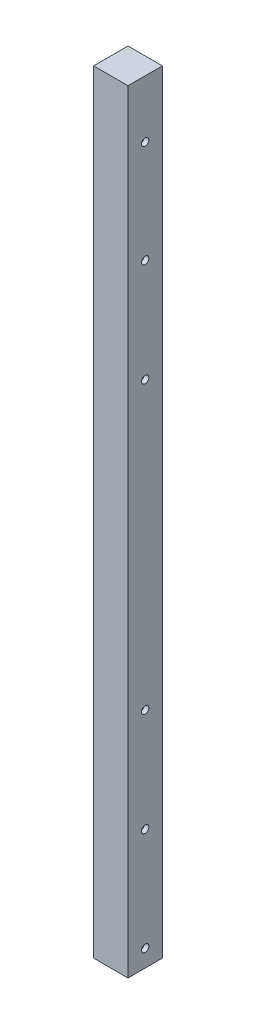
ISO-10303-21;
HEADER;
FILE_DESCRIPTION(('STEP AP214'),'2;1');
FILE_NAME('part.step','',(''),(''),'','','');
FILE_SCHEMA(('AUTOMOTIVE_DESIGN { 1 0 10303 214 1 1 1 1 }'));
ENDSEC;
DATA;
#1=APPLICATION_CONTEXT('core data for automotive mechanical design processes');
#2=APPLICATION_PROTOCOL_DEFINITION('international standard','automotive_design',2000,#1);
#3=PRODUCT_CONTEXT('',#1,'mechanical');
#4=PRODUCT('Part','Part','',(#3));
#5=PRODUCT_RELATED_PRODUCT_CATEGORY('part','',(#4));
#6=PRODUCT_DEFINITION_FORMATION('','',#4);
#7=PRODUCT_DEFINITION_CONTEXT('part definition',#1,'design');
#8=PRODUCT_DEFINITION('design','',#6,#7);
#9=PRODUCT_DEFINITION_SHAPE('','',#8);
#10=(LENGTH_UNIT() NAMED_UNIT(*) SI_UNIT(.MILLI.,.METRE.));
#11=(NAMED_UNIT(*) PLANE_ANGLE_UNIT() SI_UNIT($,.RADIAN.));
#12=(NAMED_UNIT(*) SI_UNIT($,.STERADIAN.) SOLID_ANGLE_UNIT());
#13=UNCERTAINTY_MEASURE_WITH_UNIT(LENGTH_MEASURE(1.E-05),#10,'distance_accuracy_value','');
#14=(GEOMETRIC_REPRESENTATION_CONTEXT(3) GLOBAL_UNCERTAINTY_ASSIGNED_CONTEXT((#13)) GLOBAL_UNIT_ASSIGNED_CONTEXT((#10,
#11,#12)) REPRESENTATION_CONTEXT('',''));
#15=CARTESIAN_POINT('',(0.,0.,0.));
#16=DIRECTION('',(0.,0.,1.));
#17=DIRECTION('',(1.,0.,0.));
#18=AXIS2_PLACEMENT_3D('',#15,#16,#17);
#19=CARTESIAN_POINT('',(0.,0.,0.));
#20=DIRECTION('',(0.,-1.,0.));
#21=DIRECTION('',(0.,0.,-1.));
#22=AXIS2_PLACEMENT_3D('',#19,#20,#21);
#23=PLANE('',#22);
#24=DIRECTION('',(0.,0.,1.));
#25=VECTOR('',#24,1.);
#26=CARTESIAN_POINT('',(0.,0.,0.));
#27=LINE('',#26,#25);
#28=CARTESIAN_POINT('',(0.,0.,-15.));
#29=VERTEX_POINT('',#28);
#30=CARTESIAN_POINT('',(0.,0.,0.));
#31=VERTEX_POINT('',#30);
#32=EDGE_CURVE('E116',#29,#31,#27,.T.);
#33=ORIENTED_EDGE('',*,*,#32,.F.);
#34=DIRECTION('',(-1.,0.,0.));
#35=VECTOR('',#34,1.);
#36=CARTESIAN_POINT('',(0.,0.,-15.));
#37=LINE('',#36,#35);
#38=CARTESIAN_POINT('',(15.,0.,-15.));
#39=VERTEX_POINT('',#38);
#40=EDGE_CURVE('E259',#39,#29,#37,.T.);
#41=ORIENTED_EDGE('',*,*,#40,.F.);
#42=DIRECTION('',(0.,0.,-1.));
#43=VECTOR('',#42,1.);
#44=CARTESIAN_POINT('',(15.,0.,0.));
#45=LINE('',#44,#43);
#46=CARTESIAN_POINT('',(15.,0.,0.));
#47=VERTEX_POINT('',#46);
#48=EDGE_CURVE('E265',#47,#39,#45,.T.);
#49=ORIENTED_EDGE('',*,*,#48,.F.);
#50=DIRECTION('',(1.,0.,0.));
#51=VECTOR('',#50,1.);
#52=CARTESIAN_POINT('',(0.,0.,0.));
#53=LINE('',#52,#51);
#54=EDGE_CURVE('E262',#31,#47,#53,.T.);
#55=ORIENTED_EDGE('',*,*,#54,.F.);
#56=EDGE_LOOP('',(#33,#41,#49,#55));
#57=FACE_BOUND('',#56,.T.);
#58=DIRECTION('',(0.,0.,1.));
#59=VECTOR('',#58,1.);
#60=CARTESIAN_POINT('',(2.,0.,-2.));
#61=LINE('',#60,#59);
#62=CARTESIAN_POINT('',(2.,0.,-13.));
#63=VERTEX_POINT('',#62);
#64=CARTESIAN_POINT('',(2.,0.,-2.));
#65=VERTEX_POINT('',#64);
#66=EDGE_CURVE('E241',#63,#65,#61,.T.);
#67=ORIENTED_EDGE('',*,*,#66,.T.);
#68=DIRECTION('',(1.,0.,0.));
#69=VECTOR('',#68,1.);
#70=CARTESIAN_POINT('',(2.,0.,-2.));
#71=LINE('',#70,#69);
#72=CARTESIAN_POINT('',(13.,0.,-2.));
#73=VERTEX_POINT('',#72);
#74=EDGE_CURVE('E229',#65,#73,#71,.T.);
#75=ORIENTED_EDGE('',*,*,#74,.T.);
#76=DIRECTION('',(0.,0.,-1.));
#77=VECTOR('',#76,1.);
#78=CARTESIAN_POINT('',(13.,0.,-2.));
#79=LINE('',#78,#77);
#80=CARTESIAN_POINT('',(13.,0.,-13.));
#81=VERTEX_POINT('',#80);
#82=EDGE_CURVE('E233',#73,#81,#79,.T.);
#83=ORIENTED_EDGE('',*,*,#82,.T.);
#84=DIRECTION('',(-1.,0.,0.));
#85=VECTOR('',#84,1.);
#86=CARTESIAN_POINT('',(2.,0.,-13.));
#87=LINE('',#86,#85);
#88=EDGE_CURVE('E237',#81,#63,#87,.T.);
#89=ORIENTED_EDGE('',*,*,#88,.T.);
#90=EDGE_LOOP('',(#67,#75,#83,#89));
#91=FACE_BOUND('',#90,.T.);
#92=ADVANCED_FACE('F45',(#57,#91),#23,.T.);
#93=CARTESIAN_POINT('',(0.,337.,0.));
#94=DIRECTION('',(1.,0.,0.));
#95=DIRECTION('',(0.,0.,-1.));
#96=AXIS2_PLACEMENT_3D('',#93,#94,#95);
#97=PLANE('',#96);
#98=CARTESIAN_POINT('',(0.,7.5,-7.49999999999996));
#99=DIRECTION('',(-1.,0.,0.));
#100=DIRECTION('',(0.,0.,1.));
#101=AXIS2_PLACEMENT_3D('',#98,#99,#100);
#102=CIRCLE('',#101,1.6);
#103=CARTESIAN_POINT('',(0.,7.5,-5.89999999999996));
#104=VERTEX_POINT('',#103);
#105=EDGE_CURVE('E145',#104,#104,#102,.T.);
#106=ORIENTED_EDGE('',*,*,#105,.F.);
#107=EDGE_LOOP('',(#106));
#108=FACE_BOUND('',#107,.T.);
#109=CARTESIAN_POINT('',(0.,222.3,-7.49999999999999));
#110=DIRECTION('',(-1.,0.,0.));
#111=DIRECTION('',(0.,0.,1.));
#112=AXIS2_PLACEMENT_3D('',#109,#110,#111);
#113=CIRCLE('',#112,1.6);
#114=CARTESIAN_POINT('',(0.,222.3,-5.89999999999999));
#115=VERTEX_POINT('',#114);
#116=EDGE_CURVE('E150',#115,#115,#113,.T.);
#117=ORIENTED_EDGE('',*,*,#116,.F.);
#118=EDGE_LOOP('',(#117));
#119=FACE_BOUND('',#118,.T.);
#120=CARTESIAN_POINT('',(0.,97.5,-7.49999999999997));
#121=DIRECTION('',(-1.,0.,0.));
#122=DIRECTION('',(0.,0.,1.));
#123=AXIS2_PLACEMENT_3D('',#120,#121,#122);
#124=CIRCLE('',#123,1.6);
#125=CARTESIAN_POINT('',(0.,97.5,-5.89999999999997));
#126=VERTEX_POINT('',#125);
#127=EDGE_CURVE('E182',#126,#126,#124,.T.);
#128=ORIENTED_EDGE('',*,*,#127,.F.);
#129=EDGE_LOOP('',(#128));
#130=FACE_BOUND('',#129,.T.);
#131=CARTESIAN_POINT('',(0.,52.5,-7.49999999999997));
#132=DIRECTION('',(-1.,0.,0.));
#133=DIRECTION('',(0.,0.,1.));
#134=AXIS2_PLACEMENT_3D('',#131,#132,#133);
#135=CIRCLE('',#134,1.6);
#136=CARTESIAN_POINT('',(0.,52.5,-5.89999999999997));
#137=VERTEX_POINT('',#136);
#138=EDGE_CURVE('E174',#137,#137,#135,.T.);
#139=ORIENTED_EDGE('',*,*,#138,.F.);
#140=EDGE_LOOP('',(#139));
#141=FACE_BOUND('',#140,.T.);
#142=CARTESIAN_POINT('',(0.,267.300000000004,-7.49999999999999));
#143=DIRECTION('',(-1.,0.,0.));
#144=DIRECTION('',(0.,0.,1.));
#145=AXIS2_PLACEMENT_3D('',#142,#143,#144);
#146=CIRCLE('',#145,1.6);
#147=CARTESIAN_POINT('',(0.,267.300000000004,-5.9));
#148=VERTEX_POINT('',#147);
#149=EDGE_CURVE('E166',#148,#148,#146,.T.);
#150=ORIENTED_EDGE('',*,*,#149,.F.);
#151=EDGE_LOOP('',(#150));
#152=FACE_BOUND('',#151,.T.);
#153=CARTESIAN_POINT('',(0.,312.,-7.5));
#154=DIRECTION('',(-1.,0.,0.));
#155=DIRECTION('',(0.,0.,1.));
#156=AXIS2_PLACEMENT_3D('',#153,#154,#155);
#157=CIRCLE('',#156,1.59999999999999);
#158=CARTESIAN_POINT('',(0.,312.,-5.9));
#159=VERTEX_POINT('',#158);
#160=EDGE_CURVE('E149',#159,#159,#157,.T.);
#161=ORIENTED_EDGE('',*,*,#160,.F.);
#162=EDGE_LOOP('',(#161));
#163=FACE_BOUND('',#162,.T.);
#164=DIRECTION('',(0.,-1.,0.));
#165=VECTOR('',#164,1.);
#166=CARTESIAN_POINT('',(0.,337.,0.));
#167=LINE('',#166,#165);
#168=CARTESIAN_POINT('',(0.,337.,0.));
#169=VERTEX_POINT('',#168);
#170=EDGE_CURVE('E55',#169,#31,#167,.T.);
#171=ORIENTED_EDGE('',*,*,#170,.F.);
#172=DIRECTION('',(0.,0.,-1.));
#173=VECTOR('',#172,1.);
#174=CARTESIAN_POINT('',(0.,337.,-15.));
#175=LINE('',#174,#173);
#176=CARTESIAN_POINT('',(0.,337.,-15.));
#177=VERTEX_POINT('',#176);
#178=EDGE_CURVE('E114',#169,#177,#175,.T.);
#179=ORIENTED_EDGE('',*,*,#178,.T.);
#180=DIRECTION('',(0.,-1.,0.));
#181=VECTOR('',#180,1.);
#182=CARTESIAN_POINT('',(0.,337.,-15.));
#183=LINE('',#182,#181);
#184=EDGE_CURVE('E258',#177,#29,#183,.T.);
#185=ORIENTED_EDGE('',*,*,#184,.T.);
#186=ORIENTED_EDGE('',*,*,#32,.T.);
#187=EDGE_LOOP('',(#171,#179,#185,#186));
#188=FACE_BOUND('',#187,.T.);
#189=ADVANCED_FACE('F47',(#108,#119,#130,#141,#152,#163,#188),#97,.F.);
#190=CARTESIAN_POINT('',(0.,337.,0.));
#191=DIRECTION('',(0.,0.,-1.));
#192=DIRECTION('',(-1.,0.,0.));
#193=AXIS2_PLACEMENT_3D('',#190,#191,#192);
#194=PLANE('',#193);
#195=DIRECTION('',(0.,-1.,0.));
#196=VECTOR('',#195,1.);
#197=CARTESIAN_POINT('',(15.,337.,0.));
#198=LINE('',#197,#196);
#199=CARTESIAN_POINT('',(15.,337.,0.));
#200=VERTEX_POINT('',#199);
#201=EDGE_CURVE('E121',#200,#47,#198,.T.);
#202=ORIENTED_EDGE('',*,*,#201,.F.);
#203=DIRECTION('',(-1.,0.,0.));
#204=VECTOR('',#203,1.);
#205=CARTESIAN_POINT('',(30.5291427061513,337.,0.));
#206=LINE('',#205,#204);
#207=EDGE_CURVE('E124',#200,#169,#206,.T.);
#208=ORIENTED_EDGE('',*,*,#207,.T.);
#209=ORIENTED_EDGE('',*,*,#170,.T.);
#210=ORIENTED_EDGE('',*,*,#54,.T.);
#211=EDGE_LOOP('',(#202,#208,#209,#210));
#212=FACE_BOUND('',#211,.T.);
#213=ADVANCED_FACE('F125',(#212),#194,.F.);
#214=CARTESIAN_POINT('',(15.,337.,0.));
#215=DIRECTION('',(-1.,0.,0.));
#216=DIRECTION('',(0.,0.,1.));
#217=AXIS2_PLACEMENT_3D('',#214,#215,#216);
#218=PLANE('',#217);
#219=CARTESIAN_POINT('',(15.,7.5,-7.49999999999996));
#220=DIRECTION('',(-1.,0.,0.));
#221=DIRECTION('',(0.,0.,1.));
#222=AXIS2_PLACEMENT_3D('',#219,#220,#221);
#223=CIRCLE('',#222,1.6);
#224=CARTESIAN_POINT('',(15.,7.5,-5.89999999999996));
#225=VERTEX_POINT('',#224);
#226=EDGE_CURVE('E140',#225,#225,#223,.T.);
#227=ORIENTED_EDGE('',*,*,#226,.T.);
#228=EDGE_LOOP('',(#227));
#229=FACE_BOUND('',#228,.T.);
#230=CARTESIAN_POINT('',(15.,222.3,-7.49999999999999));
#231=DIRECTION('',(-1.,0.,0.));
#232=DIRECTION('',(0.,0.,1.));
#233=AXIS2_PLACEMENT_3D('',#230,#231,#232);
#234=CIRCLE('',#233,1.6);
#235=CARTESIAN_POINT('',(15.,222.3,-5.89999999999999));
#236=VERTEX_POINT('',#235);
#237=EDGE_CURVE('E155',#236,#236,#234,.T.);
#238=ORIENTED_EDGE('',*,*,#237,.T.);
#239=EDGE_LOOP('',(#238));
#240=FACE_BOUND('',#239,.T.);
#241=CARTESIAN_POINT('',(15.,97.5,-7.49999999999997));
#242=DIRECTION('',(-1.,0.,0.));
#243=DIRECTION('',(0.,0.,1.));
#244=AXIS2_PLACEMENT_3D('',#241,#242,#243);
#245=CIRCLE('',#244,1.6);
#246=CARTESIAN_POINT('',(15.,97.5,-5.89999999999997));
#247=VERTEX_POINT('',#246);
#248=EDGE_CURVE('E154',#247,#247,#245,.T.);
#249=ORIENTED_EDGE('',*,*,#248,.T.);
#250=EDGE_LOOP('',(#249));
#251=FACE_BOUND('',#250,.T.);
#252=CARTESIAN_POINT('',(15.,52.5,-7.49999999999997));
#253=DIRECTION('',(-1.,0.,0.));
#254=DIRECTION('',(0.,0.,1.));
#255=AXIS2_PLACEMENT_3D('',#252,#253,#254);
#256=CIRCLE('',#255,1.6);
#257=CARTESIAN_POINT('',(15.,52.5,-5.89999999999997));
#258=VERTEX_POINT('',#257);
#259=EDGE_CURVE('E178',#258,#258,#256,.T.);
#260=ORIENTED_EDGE('',*,*,#259,.T.);
#261=EDGE_LOOP('',(#260));
#262=FACE_BOUND('',#261,.T.);
#263=CARTESIAN_POINT('',(15.,267.300000000004,-7.49999999999999));
#264=DIRECTION('',(-1.,0.,0.));
#265=DIRECTION('',(0.,0.,1.));
#266=AXIS2_PLACEMENT_3D('',#263,#264,#265);
#267=CIRCLE('',#266,1.6);
#268=CARTESIAN_POINT('',(15.,267.300000000004,-5.9));
#269=VERTEX_POINT('',#268);
#270=EDGE_CURVE('E170',#269,#269,#267,.T.);
#271=ORIENTED_EDGE('',*,*,#270,.T.);
#272=EDGE_LOOP('',(#271));
#273=FACE_BOUND('',#272,.T.);
#274=CARTESIAN_POINT('',(15.,312.,-7.5));
#275=DIRECTION('',(-1.,0.,0.));
#276=DIRECTION('',(0.,0.,1.));
#277=AXIS2_PLACEMENT_3D('',#274,#275,#276);
#278=CIRCLE('',#277,1.59999999999999);
#279=CARTESIAN_POINT('',(15.,312.,-5.9));
#280=VERTEX_POINT('',#279);
#281=EDGE_CURVE('E162',#280,#280,#278,.T.);
#282=ORIENTED_EDGE('',*,*,#281,.T.);
#283=EDGE_LOOP('',(#282));
#284=FACE_BOUND('',#283,.T.);
#285=DIRECTION('',(0.,-1.,0.));
#286=VECTOR('',#285,1.);
#287=CARTESIAN_POINT('',(15.,337.,-15.));
#288=LINE('',#287,#286);
#289=CARTESIAN_POINT('',(15.,337.,-15.));
#290=VERTEX_POINT('',#289);
#291=EDGE_CURVE('E272',#290,#39,#288,.T.);
#292=ORIENTED_EDGE('',*,*,#291,.F.);
#293=DIRECTION('',(0.,0.,1.));
#294=VECTOR('',#293,1.);
#295=CARTESIAN_POINT('',(15.,337.,-15.));
#296=LINE('',#295,#294);
#297=EDGE_CURVE('E130',#290,#200,#296,.T.);
#298=ORIENTED_EDGE('',*,*,#297,.T.);
#299=ORIENTED_EDGE('',*,*,#201,.T.);
#300=ORIENTED_EDGE('',*,*,#48,.T.);
#301=EDGE_LOOP('',(#292,#298,#299,#300));
#302=FACE_BOUND('',#301,.T.);
#303=ADVANCED_FACE('F324',(#229,#240,#251,#262,#273,#284,#302),#218,.F.);
#304=CARTESIAN_POINT('',(0.,337.,-15.));
#305=DIRECTION('',(0.,0.,1.));
#306=DIRECTION('',(1.,0.,0.));
#307=AXIS2_PLACEMENT_3D('',#304,#305,#306);
#308=PLANE('',#307);
#309=ORIENTED_EDGE('',*,*,#40,.T.);
#310=ORIENTED_EDGE('',*,*,#184,.F.);
#311=DIRECTION('',(-1.,0.,0.));
#312=VECTOR('',#311,1.);
#313=CARTESIAN_POINT('',(0.,337.,-15.));
#314=LINE('',#313,#312);
#315=EDGE_CURVE('E135',#290,#177,#314,.T.);
#316=ORIENTED_EDGE('',*,*,#315,.F.);
#317=ORIENTED_EDGE('',*,*,#291,.T.);
#318=EDGE_LOOP('',(#309,#310,#316,#317));
#319=FACE_BOUND('',#318,.T.);
#320=ADVANCED_FACE('F365',(#319),#308,.F.);
#321=CARTESIAN_POINT('',(2.,337.,-2.));
#322=DIRECTION('',(0.,0.,-1.));
#323=DIRECTION('',(-1.,0.,0.));
#324=AXIS2_PLACEMENT_3D('',#321,#322,#323);
#325=PLANE('',#324);
#326=DIRECTION('',(-1.,0.,0.));
#327=VECTOR('',#326,1.);
#328=CARTESIAN_POINT('',(2.,333.516660498395,-2.));
#329=LINE('',#328,#327);
#330=CARTESIAN_POINT('',(13.,333.516660498395,-2.));
#331=VERTEX_POINT('',#330);
#332=CARTESIAN_POINT('',(2.,333.516660498395,-2.));
#333=VERTEX_POINT('',#332);
#334=EDGE_CURVE('E225',#331,#333,#329,.T.);
#335=ORIENTED_EDGE('',*,*,#334,.F.);
#336=DIRECTION('',(0.,-1.,0.));
#337=VECTOR('',#336,1.);
#338=CARTESIAN_POINT('',(13.,337.,-2.));
#339=LINE('',#338,#337);
#340=EDGE_CURVE('E253',#331,#73,#339,.T.);
#341=ORIENTED_EDGE('',*,*,#340,.T.);
#342=ORIENTED_EDGE('',*,*,#74,.F.);
#343=DIRECTION('',(0.,-1.,0.));
#344=VECTOR('',#343,1.);
#345=CARTESIAN_POINT('',(2.,337.,-2.));
#346=LINE('',#345,#344);
#347=EDGE_CURVE('E65',#333,#65,#346,.T.);
#348=ORIENTED_EDGE('',*,*,#347,.F.);
#349=EDGE_LOOP('',(#335,#341,#342,#348));
#350=FACE_BOUND('',#349,.T.);
#351=ADVANCED_FACE('F381',(#350),#325,.T.);
#352=CARTESIAN_POINT('',(13.,337.,-2.));
#353=DIRECTION('',(-1.,0.,0.));
#354=DIRECTION('',(0.,0.,1.));
#355=AXIS2_PLACEMENT_3D('',#352,#353,#354);
#356=PLANE('',#355);
#357=CARTESIAN_POINT('',(13.,7.5,-7.49999999999996));
#358=DIRECTION('',(-1.,0.,0.));
#359=DIRECTION('',(0.,0.,1.));
#360=AXIS2_PLACEMENT_3D('',#357,#358,#359);
#361=CIRCLE('',#360,1.6);
#362=CARTESIAN_POINT('',(13.,7.5,-5.89999999999996));
#363=VERTEX_POINT('',#362);
#364=EDGE_CURVE('E213',#363,#363,#361,.T.);
#365=ORIENTED_EDGE('',*,*,#364,.F.);
#366=EDGE_LOOP('',(#365));
#367=FACE_BOUND('',#366,.T.);
#368=CARTESIAN_POINT('',(13.,222.3,-7.49999999999999));
#369=DIRECTION('',(-1.,0.,0.));
#370=DIRECTION('',(0.,0.,1.));
#371=AXIS2_PLACEMENT_3D('',#368,#369,#370);
#372=CIRCLE('',#371,1.6);
#373=CARTESIAN_POINT('',(13.,222.3,-5.89999999999999));
#374=VERTEX_POINT('',#373);
#375=EDGE_CURVE('E209',#374,#374,#372,.T.);
#376=ORIENTED_EDGE('',*,*,#375,.F.);
#377=EDGE_LOOP('',(#376));
#378=FACE_BOUND('',#377,.T.);
#379=CARTESIAN_POINT('',(13.,97.5,-7.49999999999997));
#380=DIRECTION('',(-1.,0.,0.));
#381=DIRECTION('',(0.,0.,1.));
#382=AXIS2_PLACEMENT_3D('',#379,#380,#381);
#383=CIRCLE('',#382,1.6);
#384=CARTESIAN_POINT('',(13.,97.5,-5.89999999999997));
#385=VERTEX_POINT('',#384);
#386=EDGE_CURVE('E204',#385,#385,#383,.T.);
#387=ORIENTED_EDGE('',*,*,#386,.F.);
#388=EDGE_LOOP('',(#387));
#389=FACE_BOUND('',#388,.T.);
#390=CARTESIAN_POINT('',(13.,52.5,-7.49999999999997));
#391=DIRECTION('',(-1.,0.,0.));
#392=DIRECTION('',(0.,0.,1.));
#393=AXIS2_PLACEMENT_3D('',#390,#391,#392);
#394=CIRCLE('',#393,1.6);
#395=CARTESIAN_POINT('',(13.,52.5,-5.89999999999997));
#396=VERTEX_POINT('',#395);
#397=EDGE_CURVE('E199',#396,#396,#394,.T.);
#398=ORIENTED_EDGE('',*,*,#397,.F.);
#399=EDGE_LOOP('',(#398));
#400=FACE_BOUND('',#399,.T.);
#401=CARTESIAN_POINT('',(13.,267.300000000004,-7.49999999999999));
#402=DIRECTION('',(-1.,0.,0.));
#403=DIRECTION('',(0.,0.,1.));
#404=AXIS2_PLACEMENT_3D('',#401,#402,#403);
#405=CIRCLE('',#404,1.6);
#406=CARTESIAN_POINT('',(13.,267.300000000004,-5.9));
#407=VERTEX_POINT('',#406);
#408=EDGE_CURVE('E194',#407,#407,#405,.T.);
#409=ORIENTED_EDGE('',*,*,#408,.F.);
#410=EDGE_LOOP('',(#409));
#411=FACE_BOUND('',#410,.T.);
#412=CARTESIAN_POINT('',(13.,312.,-7.5));
#413=DIRECTION('',(-1.,0.,0.));
#414=DIRECTION('',(0.,0.,1.));
#415=AXIS2_PLACEMENT_3D('',#412,#413,#414);
#416=CIRCLE('',#415,1.59999999999999);
#417=CARTESIAN_POINT('',(13.,312.,-5.9));
#418=VERTEX_POINT('',#417);
#419=EDGE_CURVE('E189',#418,#418,#416,.T.);
#420=ORIENTED_EDGE('',*,*,#419,.F.);
#421=EDGE_LOOP('',(#420));
#422=FACE_BOUND('',#421,.T.);
#423=DIRECTION('',(0.,-0.258819045102525,0.965925826289067));
#424=VECTOR('',#423,1.);
#425=CARTESIAN_POINT('',(13.,333.75,-2.87083487540118));
#426=LINE('',#425,#424);
#427=CARTESIAN_POINT('',(13.,336.464101615138,-13.));
#428=VERTEX_POINT('',#427);
#429=EDGE_CURVE('E221',#428,#331,#426,.T.);
#430=ORIENTED_EDGE('',*,*,#429,.F.);
#431=DIRECTION('',(0.,-1.,0.));
#432=VECTOR('',#431,1.);
#433=CARTESIAN_POINT('',(13.,337.,-13.));
#434=LINE('',#433,#432);
#435=EDGE_CURVE('E250',#428,#81,#434,.T.);
#436=ORIENTED_EDGE('',*,*,#435,.T.);
#437=ORIENTED_EDGE('',*,*,#82,.F.);
#438=ORIENTED_EDGE('',*,*,#340,.F.);
#439=EDGE_LOOP('',(#430,#436,#437,#438));
#440=FACE_BOUND('',#439,.T.);
#441=ADVANCED_FACE('F384',(#367,#378,#389,#400,#411,#422,#440),#356,.T.);
#442=CARTESIAN_POINT('',(2.,337.,-13.));
#443=DIRECTION('',(0.,0.,1.));
#444=DIRECTION('',(1.,0.,0.));
#445=AXIS2_PLACEMENT_3D('',#442,#443,#444);
#446=PLANE('',#445);
#447=DIRECTION('',(1.,0.,0.));
#448=VECTOR('',#447,1.);
#449=CARTESIAN_POINT('',(2.,336.464101615138,-13.));
#450=LINE('',#449,#448);
#451=CARTESIAN_POINT('',(2.,336.464101615138,-13.));
#452=VERTEX_POINT('',#451);
#453=EDGE_CURVE('E217',#452,#428,#450,.T.);
#454=ORIENTED_EDGE('',*,*,#453,.F.);
#455=DIRECTION('',(0.,-1.,0.));
#456=VECTOR('',#455,1.);
#457=CARTESIAN_POINT('',(2.,337.,-13.));
#458=LINE('',#457,#456);
#459=EDGE_CURVE('E247',#452,#63,#458,.T.);
#460=ORIENTED_EDGE('',*,*,#459,.T.);
#461=ORIENTED_EDGE('',*,*,#88,.F.);
#462=ORIENTED_EDGE('',*,*,#435,.F.);
#463=EDGE_LOOP('',(#454,#460,#461,#462));
#464=FACE_BOUND('',#463,.T.);
#465=ADVANCED_FACE('F300',(#464),#446,.T.);
#466=CARTESIAN_POINT('',(2.,337.,-2.));
#467=DIRECTION('',(1.,0.,0.));
#468=DIRECTION('',(0.,0.,-1.));
#469=AXIS2_PLACEMENT_3D('',#466,#467,#468);
#470=PLANE('',#469);
#471=CARTESIAN_POINT('',(2.,7.5,-7.49999999999996));
#472=DIRECTION('',(1.,0.,0.));
#473=DIRECTION('',(0.,0.,-1.));
#474=AXIS2_PLACEMENT_3D('',#471,#472,#473);
#475=CIRCLE('',#474,1.6);
#476=CARTESIAN_POINT('',(2.,7.5,-9.09999999999996));
#477=VERTEX_POINT('',#476);
#478=EDGE_CURVE('E49',#477,#477,#475,.T.);
#479=ORIENTED_EDGE('',*,*,#478,.F.);
#480=EDGE_LOOP('',(#479));
#481=FACE_BOUND('',#480,.T.);
#482=CARTESIAN_POINT('',(2.,222.3,-7.49999999999999));
#483=DIRECTION('',(1.,0.,0.));
#484=DIRECTION('',(0.,0.,-1.));
#485=AXIS2_PLACEMENT_3D('',#482,#483,#484);
#486=CIRCLE('',#485,1.6);
#487=CARTESIAN_POINT('',(2.,222.3,-9.09999999999999));
#488=VERTEX_POINT('',#487);
#489=EDGE_CURVE('E208',#488,#488,#486,.T.);
#490=ORIENTED_EDGE('',*,*,#489,.F.);
#491=EDGE_LOOP('',(#490));
#492=FACE_BOUND('',#491,.T.);
#493=CARTESIAN_POINT('',(2.,97.5,-7.49999999999997));
#494=DIRECTION('',(1.,0.,0.));
#495=DIRECTION('',(0.,0.,-1.));
#496=AXIS2_PLACEMENT_3D('',#493,#494,#495);
#497=CIRCLE('',#496,1.6);
#498=CARTESIAN_POINT('',(2.,97.5,-9.09999999999997));
#499=VERTEX_POINT('',#498);
#500=EDGE_CURVE('E203',#499,#499,#497,.T.);
#501=ORIENTED_EDGE('',*,*,#500,.F.);
#502=EDGE_LOOP('',(#501));
#503=FACE_BOUND('',#502,.T.);
#504=CARTESIAN_POINT('',(2.,52.5,-7.49999999999997));
#505=DIRECTION('',(1.,0.,0.));
#506=DIRECTION('',(0.,0.,-1.));
#507=AXIS2_PLACEMENT_3D('',#504,#505,#506);
#508=CIRCLE('',#507,1.6);
#509=CARTESIAN_POINT('',(2.,52.5,-9.09999999999997));
#510=VERTEX_POINT('',#509);
#511=EDGE_CURVE('E198',#510,#510,#508,.T.);
#512=ORIENTED_EDGE('',*,*,#511,.F.);
#513=EDGE_LOOP('',(#512));
#514=FACE_BOUND('',#513,.T.);
#515=CARTESIAN_POINT('',(2.,267.300000000004,-7.49999999999999));
#516=DIRECTION('',(1.,0.,0.));
#517=DIRECTION('',(0.,0.,-1.));
#518=AXIS2_PLACEMENT_3D('',#515,#516,#517);
#519=CIRCLE('',#518,1.6);
#520=CARTESIAN_POINT('',(2.,267.300000000004,-9.09999999999999));
#521=VERTEX_POINT('',#520);
#522=EDGE_CURVE('E193',#521,#521,#519,.T.);
#523=ORIENTED_EDGE('',*,*,#522,.F.);
#524=EDGE_LOOP('',(#523));
#525=FACE_BOUND('',#524,.T.);
#526=CARTESIAN_POINT('',(2.,312.,-7.5));
#527=DIRECTION('',(1.,0.,0.));
#528=DIRECTION('',(0.,0.,-1.));
#529=AXIS2_PLACEMENT_3D('',#526,#527,#528);
#530=CIRCLE('',#529,1.59999999999999);
#531=CARTESIAN_POINT('',(2.,312.,-9.09999999999999));
#532=VERTEX_POINT('',#531);
#533=EDGE_CURVE('E144',#532,#532,#530,.T.);
#534=ORIENTED_EDGE('',*,*,#533,.F.);
#535=EDGE_LOOP('',(#534));
#536=FACE_BOUND('',#535,.T.);
#537=DIRECTION('',(0.,0.258819045102525,-0.965925826289067));
#538=VECTOR('',#537,1.);
#539=CARTESIAN_POINT('',(2.,333.75,-2.87083487540118));
#540=LINE('',#539,#538);
#541=EDGE_CURVE('E11',#333,#452,#540,.T.);
#542=ORIENTED_EDGE('',*,*,#541,.F.);
#543=ORIENTED_EDGE('',*,*,#347,.T.);
#544=ORIENTED_EDGE('',*,*,#66,.F.);
#545=ORIENTED_EDGE('',*,*,#459,.F.);
#546=EDGE_LOOP('',(#542,#543,#544,#545));
#547=FACE_BOUND('',#546,.T.);
#548=ADVANCED_FACE('F296',(#481,#492,#503,#514,#525,#536,#547),#470,.T.);
#549=CARTESIAN_POINT('',(15.,312.,-7.5));
#550=DIRECTION('',(-1.,0.,0.));
#551=DIRECTION('',(0.,0.,1.));
#552=AXIS2_PLACEMENT_3D('',#549,#550,#551);
#553=CYLINDRICAL_SURFACE('',#552,1.59999999999999);
#554=ORIENTED_EDGE('',*,*,#533,.T.);
#555=EDGE_LOOP('',(#554));
#556=FACE_BOUND('',#555,.T.);
#557=ORIENTED_EDGE('',*,*,#160,.T.);
#558=EDGE_LOOP('',(#557));
#559=FACE_BOUND('',#558,.T.);
#560=ADVANCED_FACE('F299',(#556,#559),#553,.F.);
#561=CARTESIAN_POINT('',(15.,267.300000000004,-7.49999999999999));
#562=DIRECTION('',(-1.,0.,0.));
#563=DIRECTION('',(0.,0.,1.));
#564=AXIS2_PLACEMENT_3D('',#561,#562,#563);
#565=CYLINDRICAL_SURFACE('',#564,1.6);
#566=ORIENTED_EDGE('',*,*,#522,.T.);
#567=EDGE_LOOP('',(#566));
#568=FACE_BOUND('',#567,.T.);
#569=ORIENTED_EDGE('',*,*,#149,.T.);
#570=EDGE_LOOP('',(#569));
#571=FACE_BOUND('',#570,.T.);
#572=ADVANCED_FACE('F313',(#568,#571),#565,.F.);
#573=CARTESIAN_POINT('',(15.,52.5,-7.49999999999997));
#574=DIRECTION('',(-1.,0.,0.));
#575=DIRECTION('',(0.,0.,1.));
#576=AXIS2_PLACEMENT_3D('',#573,#574,#575);
#577=CYLINDRICAL_SURFACE('',#576,1.6);
#578=ORIENTED_EDGE('',*,*,#511,.T.);
#579=EDGE_LOOP('',(#578));
#580=FACE_BOUND('',#579,.T.);
#581=ORIENTED_EDGE('',*,*,#138,.T.);
#582=EDGE_LOOP('',(#581));
#583=FACE_BOUND('',#582,.T.);
#584=ADVANCED_FACE('F338',(#580,#583),#577,.F.);
#585=CARTESIAN_POINT('',(15.,97.5,-7.49999999999997));
#586=DIRECTION('',(-1.,0.,0.));
#587=DIRECTION('',(0.,0.,1.));
#588=AXIS2_PLACEMENT_3D('',#585,#586,#587);
#589=CYLINDRICAL_SURFACE('',#588,1.6);
#590=ORIENTED_EDGE('',*,*,#500,.T.);
#591=EDGE_LOOP('',(#590));
#592=FACE_BOUND('',#591,.T.);
#593=ORIENTED_EDGE('',*,*,#127,.T.);
#594=EDGE_LOOP('',(#593));
#595=FACE_BOUND('',#594,.T.);
#596=ADVANCED_FACE('F345',(#592,#595),#589,.F.);
#597=CARTESIAN_POINT('',(15.,222.3,-7.49999999999999));
#598=DIRECTION('',(-1.,0.,0.));
#599=DIRECTION('',(0.,0.,1.));
#600=AXIS2_PLACEMENT_3D('',#597,#598,#599);
#601=CYLINDRICAL_SURFACE('',#600,1.6);
#602=ORIENTED_EDGE('',*,*,#489,.T.);
#603=EDGE_LOOP('',(#602));
#604=FACE_BOUND('',#603,.T.);
#605=ORIENTED_EDGE('',*,*,#116,.T.);
#606=EDGE_LOOP('',(#605));
#607=FACE_BOUND('',#606,.T.);
#608=ADVANCED_FACE('F293',(#604,#607),#601,.F.);
#609=CARTESIAN_POINT('',(15.,7.5,-7.49999999999996));
#610=DIRECTION('',(-1.,0.,0.));
#611=DIRECTION('',(0.,0.,1.));
#612=AXIS2_PLACEMENT_3D('',#609,#610,#611);
#613=CYLINDRICAL_SURFACE('',#612,1.6);
#614=ORIENTED_EDGE('',*,*,#478,.T.);
#615=EDGE_LOOP('',(#614));
#616=FACE_BOUND('',#615,.T.);
#617=ORIENTED_EDGE('',*,*,#105,.T.);
#618=EDGE_LOOP('',(#617));
#619=FACE_BOUND('',#618,.T.);
#620=ADVANCED_FACE('F357',(#616,#619),#613,.F.);
#621=ORIENTED_EDGE('',*,*,#419,.T.);
#622=EDGE_LOOP('',(#621));
#623=FACE_BOUND('',#622,.T.);
#624=ORIENTED_EDGE('',*,*,#281,.F.);
#625=EDGE_LOOP('',(#624));
#626=FACE_BOUND('',#625,.T.);
#627=ADVANCED_FACE('F315',(#623,#626),#553,.F.);
#628=ORIENTED_EDGE('',*,*,#408,.T.);
#629=EDGE_LOOP('',(#628));
#630=FACE_BOUND('',#629,.T.);
#631=ORIENTED_EDGE('',*,*,#270,.F.);
#632=EDGE_LOOP('',(#631));
#633=FACE_BOUND('',#632,.T.);
#634=ADVANCED_FACE('F341',(#630,#633),#565,.F.);
#635=ORIENTED_EDGE('',*,*,#397,.T.);
#636=EDGE_LOOP('',(#635));
#637=FACE_BOUND('',#636,.T.);
#638=ORIENTED_EDGE('',*,*,#259,.F.);
#639=EDGE_LOOP('',(#638));
#640=FACE_BOUND('',#639,.T.);
#641=ADVANCED_FACE('F348',(#637,#640),#577,.F.);
#642=ORIENTED_EDGE('',*,*,#386,.T.);
#643=EDGE_LOOP('',(#642));
#644=FACE_BOUND('',#643,.T.);
#645=ORIENTED_EDGE('',*,*,#248,.F.);
#646=EDGE_LOOP('',(#645));
#647=FACE_BOUND('',#646,.T.);
#648=ADVANCED_FACE('F355',(#644,#647),#589,.F.);
#649=ORIENTED_EDGE('',*,*,#375,.T.);
#650=EDGE_LOOP('',(#649));
#651=FACE_BOUND('',#650,.T.);
#652=ORIENTED_EDGE('',*,*,#237,.F.);
#653=EDGE_LOOP('',(#652));
#654=FACE_BOUND('',#653,.T.);
#655=ADVANCED_FACE('F455',(#651,#654),#601,.F.);
#656=ORIENTED_EDGE('',*,*,#364,.T.);
#657=EDGE_LOOP('',(#656));
#658=FACE_BOUND('',#657,.T.);
#659=ORIENTED_EDGE('',*,*,#226,.F.);
#660=EDGE_LOOP('',(#659));
#661=FACE_BOUND('',#660,.T.);
#662=ADVANCED_FACE('F433',(#658,#661),#613,.F.);
#663=CARTESIAN_POINT('',(30.5291427061513,332.980762113533,0.));
#664=DIRECTION('',(0.,-0.965925826289067,-0.258819045102525));
#665=DIRECTION('',(0.,0.258819045102525,-0.965925826289067));
#666=AXIS2_PLACEMENT_3D('',#663,#664,#665);
#667=PLANE('',#666);
#668=ORIENTED_EDGE('',*,*,#429,.T.);
#669=ORIENTED_EDGE('',*,*,#334,.T.);
#670=ORIENTED_EDGE('',*,*,#541,.T.);
#671=ORIENTED_EDGE('',*,*,#453,.T.);
#672=EDGE_LOOP('',(#668,#669,#670,#671));
#673=FACE_BOUND('',#672,.T.);
#674=ADVANCED_FACE('F378',(#673),#667,.T.);
#675=CARTESIAN_POINT('',(30.5291427061513,337.,-15.));
#676=DIRECTION('',(0.,1.,0.));
#677=DIRECTION('',(0.,0.,1.));
#678=AXIS2_PLACEMENT_3D('',#675,#676,#677);
#679=PLANE('',#678);
#680=ORIENTED_EDGE('',*,*,#297,.F.);
#681=ORIENTED_EDGE('',*,*,#315,.T.);
#682=ORIENTED_EDGE('',*,*,#178,.F.);
#683=ORIENTED_EDGE('',*,*,#207,.F.);
#684=EDGE_LOOP('',(#680,#681,#682,#683));
#685=FACE_BOUND('',#684,.T.);
#686=ADVANCED_FACE('F133',(#685),#679,.T.);
#687=CLOSED_SHELL('',(#92,#189,#213,#303,#320,#351,#441,#465,#548,#560,#572,#584,#596,#608,#620,
#627,#634,#641,#648,#655,#662,#674,#686));
#688=MANIFOLD_SOLID_BREP('B2',#687);
#689=ADVANCED_BREP_SHAPE_REPRESENTATION('',(#18,#688),#14);
#690=SHAPE_DEFINITION_REPRESENTATION(#9,#689);
ENDSEC;
END-ISO-10303-21;
